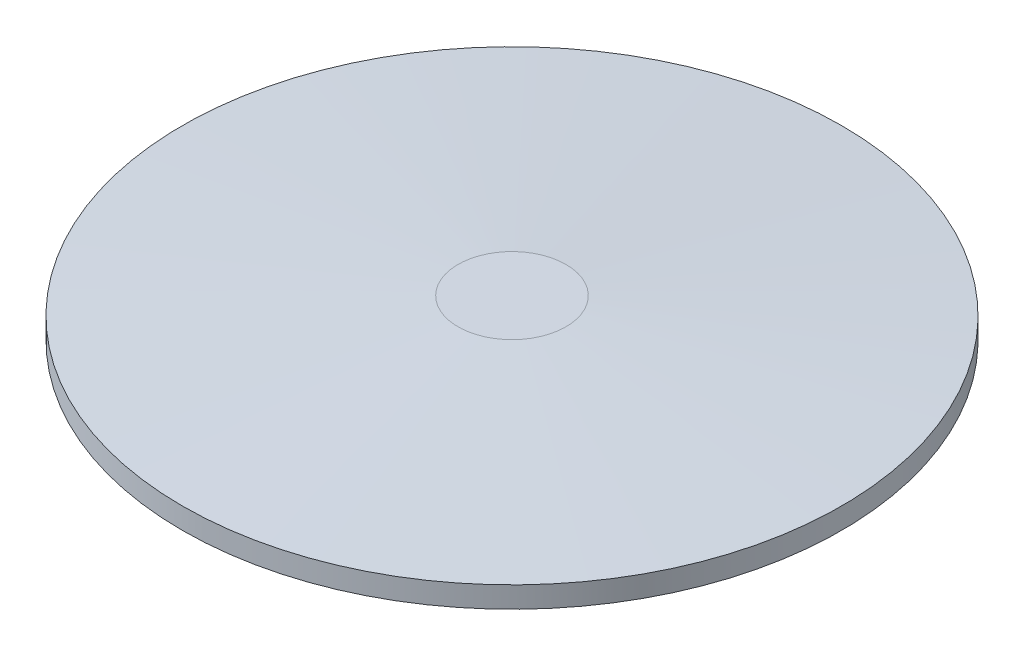
ISO-10303-21;
HEADER;
FILE_DESCRIPTION(('STEP AP214'),'2;1');
FILE_NAME('part.step','',(''),(''),'','','');
FILE_SCHEMA(('AUTOMOTIVE_DESIGN { 1 0 10303 214 1 1 1 1 }'));
ENDSEC;
DATA;
#1=APPLICATION_CONTEXT('core data for automotive mechanical design processes');
#2=APPLICATION_PROTOCOL_DEFINITION('international standard','automotive_design',2000,#1);
#3=PRODUCT_CONTEXT('',#1,'mechanical');
#4=PRODUCT('Part','Part','',(#3));
#5=PRODUCT_RELATED_PRODUCT_CATEGORY('part','',(#4));
#6=PRODUCT_DEFINITION_FORMATION('','',#4);
#7=PRODUCT_DEFINITION_CONTEXT('part definition',#1,'design');
#8=PRODUCT_DEFINITION('design','',#6,#7);
#9=PRODUCT_DEFINITION_SHAPE('','',#8);
#10=(LENGTH_UNIT() NAMED_UNIT(*) SI_UNIT(.MILLI.,.METRE.));
#11=(NAMED_UNIT(*) PLANE_ANGLE_UNIT() SI_UNIT($,.RADIAN.));
#12=(NAMED_UNIT(*) SI_UNIT($,.STERADIAN.) SOLID_ANGLE_UNIT());
#13=UNCERTAINTY_MEASURE_WITH_UNIT(LENGTH_MEASURE(1.E-05),#10,'distance_accuracy_value','');
#14=(GEOMETRIC_REPRESENTATION_CONTEXT(3) GLOBAL_UNCERTAINTY_ASSIGNED_CONTEXT((#13)) GLOBAL_UNIT_ASSIGNED_CONTEXT((#10,
#11,#12)) REPRESENTATION_CONTEXT('',''));
#15=CARTESIAN_POINT('',(0.,0.,0.));
#16=DIRECTION('',(0.,0.,1.));
#17=DIRECTION('',(1.,0.,0.));
#18=AXIS2_PLACEMENT_3D('',#15,#16,#17);
#19=CARTESIAN_POINT('',(0.,-3.36925369232769,0.));
#20=DIRECTION('',(0.,-1.,0.));
#21=DIRECTION('',(0.,0.,-1.));
#22=AXIS2_PLACEMENT_3D('',#19,#20,#21);
#23=PLANE('',#22);
#24=CARTESIAN_POINT('',(0.,-3.36925369232769,0.));
#25=DIRECTION('',(0.,-1.,0.));
#26=DIRECTION('',(0.,0.,-1.));
#27=AXIS2_PLACEMENT_3D('',#24,#25,#26);
#28=CIRCLE('',#27,6.17576762616901);
#29=CARTESIAN_POINT('',(0.,-3.36925369232769,-6.17576762616901));
#30=VERTEX_POINT('',#29);
#31=EDGE_CURVE('E10',#30,#30,#28,.T.);
#32=ORIENTED_EDGE('',*,*,#31,.T.);
#33=EDGE_LOOP('',(#32));
#34=FACE_BOUND('',#33,.T.);
#35=ADVANCED_FACE('F37',(#34),#23,.T.);
#36=CARTESIAN_POINT('',(0.,-3.36925369232769,0.));
#37=DIRECTION('',(0.,-1.,0.));
#38=DIRECTION('',(0.,0.,-1.));
#39=AXIS2_PLACEMENT_3D('',#36,#37,#38);
#40=CYLINDRICAL_SURFACE('',#39,6.17576762616901);
#41=CARTESIAN_POINT('',(0.,-2.58351910137679,0.));
#42=DIRECTION('',(0.,-1.,0.));
#43=DIRECTION('',(0.,0.,-1.));
#44=AXIS2_PLACEMENT_3D('',#41,#42,#43);
#45=CIRCLE('',#44,6.17576762616901);
#46=CARTESIAN_POINT('',(0.,-2.58351910137679,6.17576762616902));
#47=VERTEX_POINT('',#46);
#48=EDGE_CURVE('E43',#47,#47,#45,.T.);
#49=ORIENTED_EDGE('',*,*,#48,.T.);
#50=EDGE_LOOP('',(#49));
#51=FACE_BOUND('',#50,.T.);
#52=ORIENTED_EDGE('',*,*,#31,.F.);
#53=EDGE_LOOP('',(#52));
#54=FACE_BOUND('',#53,.T.);
#55=ADVANCED_FACE('F72',(#51,#54),#40,.T.);
#56=CARTESIAN_POINT('',(0.,-2.58351910137679,0.));
#57=DIRECTION('',(0.,1.,0.));
#58=DIRECTION('',(0.,0.,1.));
#59=AXIS2_PLACEMENT_3D('',#56,#57,#58);
#60=CONICAL_SURFACE('',#59,6.17576762616901,1.52744197513738);
#61=CARTESIAN_POINT('',(0.,-1.215949510076,0.));
#62=DIRECTION('',(0.,-1.,0.));
#63=DIRECTION('',(0.,0.,-1.));
#64=AXIS2_PLACEMENT_3D('',#61,#62,#63);
#65=CIRCLE('',#64,37.7);
#66=CARTESIAN_POINT('',(0.,-1.215949510076,37.6999999999999));
#67=VERTEX_POINT('',#66);
#68=EDGE_CURVE('E47',#67,#67,#65,.T.);
#69=CARTESIAN_POINT('',(0.,-1.215949510076,37.6999999999999));
#70=CARTESIAN_POINT('',(0.,-1.23019502665205,37.3716225794392));
#71=CARTESIAN_POINT('',(0.,-1.2444405432281,37.0432451588785));
#72=CARTESIAN_POINT('',(0.,-1.2729315763802,36.386490317757));
#73=CARTESIAN_POINT('',(0.,-1.28717709295625,36.0581128971962));
#74=CARTESIAN_POINT('',(0.,-1.31566812610835,35.4013580560748));
#75=CARTESIAN_POINT('',(0.,-1.3299136426844,35.072980635514));
#76=CARTESIAN_POINT('',(0.,-1.3584046758365,34.4162257943926));
#77=CARTESIAN_POINT('',(0.,-1.37265019241255,34.0878483738318));
#78=CARTESIAN_POINT('',(0.,-1.40114122556465,33.4310935327103));
#79=CARTESIAN_POINT('',(0.,-1.4153867421407,33.1027161121496));
#80=CARTESIAN_POINT('',(0.,-1.4438777752928,32.4459612710281));
#81=CARTESIAN_POINT('',(0.,-1.45812329186885,32.1175838504674));
#82=CARTESIAN_POINT('',(0.,-1.48661432502095,31.4608290093459));
#83=CARTESIAN_POINT('',(0.,-1.500859841597,31.1324515887852));
#84=CARTESIAN_POINT('',(0.,-1.5293508747491,30.4756967476637));
#85=CARTESIAN_POINT('',(0.,-1.54359639132515,30.1473193271029));
#86=CARTESIAN_POINT('',(0.,-1.57208742447725,29.4905644859815));
#87=CARTESIAN_POINT('',(0.,-1.5863329410533,29.1621870654207));
#88=CARTESIAN_POINT('',(0.,-1.6148239742054,28.5054322242993));
#89=CARTESIAN_POINT('',(0.,-1.62906949078145,28.1770548037385));
#90=CARTESIAN_POINT('',(0.,-1.65756052393355,27.520299962617));
#91=CARTESIAN_POINT('',(0.,-1.6718060405096,27.1919225420563));
#92=CARTESIAN_POINT('',(0.,-1.70029707366169,26.5351677009348));
#93=CARTESIAN_POINT('',(0.,-1.71454259023774,26.2067902803741));
#94=CARTESIAN_POINT('',(0.,-1.74303362338984,25.5500354392526));
#95=CARTESIAN_POINT('',(0.,-1.75727913996589,25.2216580186919));
#96=CARTESIAN_POINT('',(0.,-1.78577017311799,24.5649031775704));
#97=CARTESIAN_POINT('',(0.,-1.80001568969404,24.2365257570096));
#98=CARTESIAN_POINT('',(0.,-1.82850672284614,23.5797709158882));
#99=CARTESIAN_POINT('',(0.,-1.84275223942219,23.2513934953274));
#100=CARTESIAN_POINT('',(0.,-1.87124327257429,22.594638654206));
#101=CARTESIAN_POINT('',(0.,-1.88548878915034,22.2662612336452));
#102=CARTESIAN_POINT('',(0.,-1.91397982230244,21.6095063925237));
#103=CARTESIAN_POINT('',(0.,-1.92822533887849,21.281128971963));
#104=CARTESIAN_POINT('',(0.,-1.95671637203059,20.6243741308415));
#105=CARTESIAN_POINT('',(0.,-1.97096188860664,20.2959967102808));
#106=CARTESIAN_POINT('',(0.,-1.99945292175874,19.6392418691593));
#107=CARTESIAN_POINT('',(0.,-2.01369843833479,19.3108644485986));
#108=CARTESIAN_POINT('',(0.,-2.04218947148689,18.6541096074771));
#109=CARTESIAN_POINT('',(0.,-2.05643498806294,18.3257321869164));
#110=CARTESIAN_POINT('',(0.,-2.08492602121504,17.6689773457949));
#111=CARTESIAN_POINT('',(0.,-2.09917153779109,17.3405999252341));
#112=CARTESIAN_POINT('',(0.,-2.12766257094319,16.6838450841127));
#113=CARTESIAN_POINT('',(0.,-2.14190808751924,16.3554676635519));
#114=CARTESIAN_POINT('',(0.,-2.17039912067134,15.6987128224304));
#115=CARTESIAN_POINT('',(0.,-2.18464463724739,15.3703354018697));
#116=CARTESIAN_POINT('',(0.,-2.21313567039949,14.7135805607482));
#117=CARTESIAN_POINT('',(0.,-2.22738118697554,14.3852031401875));
#118=CARTESIAN_POINT('',(0.,-2.25587222012764,13.728448299066));
#119=CARTESIAN_POINT('',(0.,-2.27011773670369,13.4000708785053));
#120=CARTESIAN_POINT('',(0.,-2.29860876985579,12.7433160373838));
#121=CARTESIAN_POINT('',(0.,-2.31285428643184,12.4149386168231));
#122=CARTESIAN_POINT('',(0.,-2.34134531958394,11.7581837757016));
#123=CARTESIAN_POINT('',(0.,-2.35559083615999,11.4298063551408));
#124=CARTESIAN_POINT('',(0.,-2.38408186931209,10.7730515140194));
#125=CARTESIAN_POINT('',(0.,-2.39832738588814,10.4446740934586));
#126=CARTESIAN_POINT('',(0.,-2.42681841904024,9.78791925233714));
#127=CARTESIAN_POINT('',(0.,-2.44106393561629,9.4595418317764));
#128=CARTESIAN_POINT('',(0.,-2.46955496876839,8.80278699065493));
#129=CARTESIAN_POINT('',(0.,-2.48380048534444,8.47440957009419));
#130=CARTESIAN_POINT('',(0.,-2.51229151849654,7.81765472897271));
#131=CARTESIAN_POINT('',(0.,-2.52653703507259,7.48927730841197));
#132=CARTESIAN_POINT('',(0.,-2.55502806822469,6.8325224672905));
#133=CARTESIAN_POINT('',(0.,-2.56927358480074,6.50414504672976));
#134=CARTESIAN_POINT('',(0.,-2.58351910137679,6.17576762616902));
#135=B_SPLINE_CURVE_WITH_KNOTS('',3,(#69,#70,#71,#72,#73,#74,#75,#76,#77,#78,#79,#80,#81,#82,
#83,#84,#85,#86,#87,#88,#89,#90,#91,#92,#93,#94,#95,#96,#97,#98,#99,#100,#101,#102,#103,#104,
#105,#106,#107,#108,#109,#110,#111,#112,#113,#114,#115,#116,#117,#118,#119,#120,#121,#122,#123,
#124,#125,#126,#127,#128,#129,#130,#131,#132,#133,#134),.UNSPECIFIED.,.F.,.F.,(4,2,2,2,2,2,2,2,
2,2,2,2,2,2,2,2,2,2,2,2,2,2,2,2,2,2,2,2,2,2,2,2,4),(0.,0.98605881451858,1.97211762903715,
2.95817644355573,3.94423525807431,4.93029407259289,5.91635288711147,6.90241170163005,
7.88847051614863,8.8745293306672,9.86058814518579,10.8466469597044,11.8327057742229,
12.8187645887415,13.8048234032601,14.7908822177787,15.7769410322973,16.7629998468158,
17.7490586613344,18.735117475853,19.7211762903716,20.7072351048901,21.6932939194087,
22.6793527339273,23.6654115484459,24.6514703629645,25.637529177483,26.6235879920016,
27.6096468065202,28.5957056210388,29.5817644355574,30.5678232500759,31.5538820645945),.UNSPECIFIED.);
#136=EDGE_CURVE('BSEAM76',#67,#47,#135,.T.);
#137=ORIENTED_EDGE('',*,*,#68,.T.);
#138=ORIENTED_EDGE('',*,*,#48,.F.);
#139=ORIENTED_EDGE('',*,*,#136,.T.);
#140=ORIENTED_EDGE('',*,*,#136,.F.);
#141=EDGE_LOOP('',(#137,#139,#138,#140));
#142=FACE_BOUND('',#141,.T.);
#143=ADVANCED_FACE('F76',(#142),#60,.T.);
#144=CARTESIAN_POINT('',(0.,-3.36925369232769,0.));
#145=DIRECTION('',(0.,-1.,0.));
#146=DIRECTION('',(0.,0.,-1.));
#147=AXIS2_PLACEMENT_3D('',#144,#145,#146);
#148=CYLINDRICAL_SURFACE('',#147,37.7);
#149=CARTESIAN_POINT('',(0.,1.20358914819971,0.));
#150=DIRECTION('',(0.,-1.,0.));
#151=DIRECTION('',(0.,0.,-1.));
#152=AXIS2_PLACEMENT_3D('',#149,#150,#151);
#153=CIRCLE('',#152,37.7);
#154=CARTESIAN_POINT('',(0.,1.20358914819971,-37.7));
#155=VERTEX_POINT('',#154);
#156=EDGE_CURVE('E51',#155,#155,#153,.T.);
#157=ORIENTED_EDGE('',*,*,#156,.T.);
#158=EDGE_LOOP('',(#157));
#159=FACE_BOUND('',#158,.T.);
#160=ORIENTED_EDGE('',*,*,#68,.F.);
#161=EDGE_LOOP('',(#160));
#162=FACE_BOUND('',#161,.T.);
#163=ADVANCED_FACE('F69',(#159,#162),#148,.T.);
#164=CARTESIAN_POINT('',(0.,1.20358914819971,0.));
#165=DIRECTION('',(0.,-1.,0.));
#166=DIRECTION('',(0.,0.,-1.));
#167=AXIS2_PLACEMENT_3D('',#164,#165,#166);
#168=CONICAL_SURFACE('',#167,37.7,1.50747730237554);
#169=CARTESIAN_POINT('',(0.,3.20234470471625,0.));
#170=DIRECTION('',(0.,-1.,0.));
#171=DIRECTION('',(0.,0.,-1.));
#172=AXIS2_PLACEMENT_3D('',#169,#170,#171);
#173=CIRCLE('',#172,6.17576762616901);
#174=CARTESIAN_POINT('',(0.,3.20234470471625,-6.17576762616907));
#175=VERTEX_POINT('',#174);
#176=EDGE_CURVE('E56',#175,#175,#173,.T.);
#177=CARTESIAN_POINT('',(0.,3.20234470471625,-6.17576762616907));
#178=CARTESIAN_POINT('',(0.,3.18152433433587,-6.5041450467298));
#179=CARTESIAN_POINT('',(0.,3.16070396395549,-6.83252246729054));
#180=CARTESIAN_POINT('',(0.,3.11906322319473,-7.48927730841202));
#181=CARTESIAN_POINT('',(0.,3.09824285281435,-7.81765472897276));
#182=CARTESIAN_POINT('',(0.,3.05660211205359,-8.47440957009424));
#183=CARTESIAN_POINT('',(0.,3.03578174167321,-8.80278699065498));
#184=CARTESIAN_POINT('',(0.,2.99414100091245,-9.45954183177645));
#185=CARTESIAN_POINT('',(0.,2.97332063053207,-9.78791925233719));
#186=CARTESIAN_POINT('',(0.,2.93167988977131,-10.4446740934587));
#187=CARTESIAN_POINT('',(0.,2.91085951939092,-10.7730515140194));
#188=CARTESIAN_POINT('',(0.,2.86921877863016,-11.4298063551409));
#189=CARTESIAN_POINT('',(0.,2.84839840824978,-11.7581837757016));
#190=CARTESIAN_POINT('',(0.,2.80675766748902,-12.4149386168231));
#191=CARTESIAN_POINT('',(0.,2.78593729710864,-12.7433160373838));
#192=CARTESIAN_POINT('',(0.,2.74429655634788,-13.4000708785053));
#193=CARTESIAN_POINT('',(0.,2.7234761859675,-13.7284482990661));
#194=CARTESIAN_POINT('',(0.,2.68183544520674,-14.3852031401875));
#195=CARTESIAN_POINT('',(0.,2.66101507482636,-14.7135805607483));
#196=CARTESIAN_POINT('',(0.,2.6193743340656,-15.3703354018698));
#197=CARTESIAN_POINT('',(0.,2.59855396368522,-15.6987128224305));
#198=CARTESIAN_POINT('',(0.,2.55691322292445,-16.355467663552));
#199=CARTESIAN_POINT('',(0.,2.53609285254407,-16.6838450841127));
#200=CARTESIAN_POINT('',(0.,2.49445211178331,-17.3405999252342));
#201=CARTESIAN_POINT('',(0.,2.47363174140293,-17.6689773457949));
#202=CARTESIAN_POINT('',(0.,2.43199100064217,-18.3257321869164));
#203=CARTESIAN_POINT('',(0.,2.41117063026179,-18.6541096074771));
#204=CARTESIAN_POINT('',(0.,2.36952988950103,-19.3108644485986));
#205=CARTESIAN_POINT('',(0.,2.34870951912065,-19.6392418691594));
#206=CARTESIAN_POINT('',(0.,2.30706877835989,-20.2959967102808));
#207=CARTESIAN_POINT('',(0.,2.28624840797951,-20.6243741308416));
#208=CARTESIAN_POINT('',(0.,2.24460766721874,-21.2811289719631));
#209=CARTESIAN_POINT('',(0.,2.22378729683836,-21.6095063925238));
#210=CARTESIAN_POINT('',(0.,2.1821465560776,-22.2662612336453));
#211=CARTESIAN_POINT('',(0.,2.16132618569722,-22.594638654206));
#212=CARTESIAN_POINT('',(0.,2.11968544493646,-23.2513934953275));
#213=CARTESIAN_POINT('',(0.,2.09886507455608,-23.5797709158882));
#214=CARTESIAN_POINT('',(0.,2.05722433379532,-24.2365257570097));
#215=CARTESIAN_POINT('',(0.,2.03640396341494,-24.5649031775704));
#216=CARTESIAN_POINT('',(0.,1.99476322265418,-25.2216580186919));
#217=CARTESIAN_POINT('',(0.,1.9739428522738,-25.5500354392527));
#218=CARTESIAN_POINT('',(0.,1.93230211151304,-26.2067902803741));
#219=CARTESIAN_POINT('',(0.,1.91148174113266,-26.5351677009349));
#220=CARTESIAN_POINT('',(0.,1.86984100037189,-27.1919225420564));
#221=CARTESIAN_POINT('',(0.,1.84902062999151,-27.5202999626171));
#222=CARTESIAN_POINT('',(0.,1.80737988923075,-28.1770548037386));
#223=CARTESIAN_POINT('',(0.,1.78655951885037,-28.5054322242993));
#224=CARTESIAN_POINT('',(0.,1.74491877808961,-29.1621870654208));
#225=CARTESIAN_POINT('',(0.,1.72409840770923,-29.4905644859815));
#226=CARTESIAN_POINT('',(0.,1.68245766694847,-30.147319327103));
#227=CARTESIAN_POINT('',(0.,1.66163729656809,-30.4756967476637));
#228=CARTESIAN_POINT('',(0.,1.61999655580733,-31.1324515887852));
#229=CARTESIAN_POINT('',(0.,1.59917618542695,-31.460829009346));
#230=CARTESIAN_POINT('',(0.,1.55753544466618,-32.1175838504674));
#231=CARTESIAN_POINT('',(0.,1.5367150742858,-32.4459612710282));
#232=CARTESIAN_POINT('',(0.,1.49507433352504,-33.1027161121497));
#233=CARTESIAN_POINT('',(0.,1.47425396314466,-33.4310935327104));
#234=CARTESIAN_POINT('',(0.,1.4326132223839,-34.0878483738319));
#235=CARTESIAN_POINT('',(0.,1.41179285200352,-34.4162257943926));
#236=CARTESIAN_POINT('',(0.,1.37015211124276,-35.0729806355141));
#237=CARTESIAN_POINT('',(0.,1.34933174086238,-35.4013580560748));
#238=CARTESIAN_POINT('',(0.,1.30769100010162,-36.0581128971963));
#239=CARTESIAN_POINT('',(0.,1.28687062972124,-36.3864903177571));
#240=CARTESIAN_POINT('',(0.,1.24522988896048,-37.0432451588785));
#241=CARTESIAN_POINT('',(0.,1.22440951858009,-37.3716225794393));
#242=CARTESIAN_POINT('',(0.,1.20358914819971,-37.7));
#243=B_SPLINE_CURVE_WITH_KNOTS('',3,(#177,#178,#179,#180,#181,#182,#183,#184,#185,#186,#187,
#188,#189,#190,#191,#192,#193,#194,#195,#196,#197,#198,#199,#200,#201,#202,#203,#204,#205,#206,
#207,#208,#209,#210,#211,#212,#213,#214,#215,#216,#217,#218,#219,#220,#221,#222,#223,#224,#225,
#226,#227,#228,#229,#230,#231,#232,#233,#234,#235,#236,#237,#238,#239,#240,#241,#242),
.UNSPECIFIED.,.F.,.F.,(4,2,2,2,2,2,2,2,2,2,2,2,2,2,2,2,2,2,2,2,2,2,2,2,2,2,2,2,2,2,2,2,4),(0.,
0.987110410953152,1.97422082190631,2.96133123285946,3.94844164381262,4.93555205476577,
5.92266246571892,6.90977287667208,7.89688328762523,8.88399369857839,9.87110410953154,
10.8582145204847,11.8453249314378,12.832435342391,13.8195457533442,14.8066561642973,
15.7937665752505,16.7808769862036,17.7679873971568,18.7550978081099,19.7422082190631,
20.7293186300162,21.7164290409694,22.7035394519226,23.6906498628757,24.6777602738289,
25.664870684782,26.6519810957352,27.6390915066883,28.6262019176415,29.6133123285947,
30.6004227395478,31.587533150501),.UNSPECIFIED.);
#244=EDGE_CURVE('BSEAM60',#175,#155,#243,.T.);
#245=ORIENTED_EDGE('',*,*,#176,.T.);
#246=ORIENTED_EDGE('',*,*,#156,.F.);
#247=ORIENTED_EDGE('',*,*,#244,.T.);
#248=ORIENTED_EDGE('',*,*,#244,.F.);
#249=EDGE_LOOP('',(#245,#247,#246,#248));
#250=FACE_BOUND('',#249,.T.);
#251=ADVANCED_FACE('F60',(#250),#168,.T.);
#252=CARTESIAN_POINT('',(-6.17576762616901,3.20234470471625,0.));
#253=DIRECTION('',(0.,1.,0.));
#254=DIRECTION('',(0.,0.,1.));
#255=AXIS2_PLACEMENT_3D('',#252,#253,#254);
#256=PLANE('',#255);
#257=ORIENTED_EDGE('',*,*,#176,.F.);
#258=EDGE_LOOP('',(#257));
#259=FACE_BOUND('',#258,.T.);
#260=ADVANCED_FACE('F63',(#259),#256,.T.);
#261=CLOSED_SHELL('',(#35,#55,#143,#163,#251,#260));
#262=MANIFOLD_SOLID_BREP('B2',#261);
#263=ADVANCED_BREP_SHAPE_REPRESENTATION('',(#18,#262),#14);
#264=SHAPE_DEFINITION_REPRESENTATION(#9,#263);
ENDSEC;
END-ISO-10303-21;
